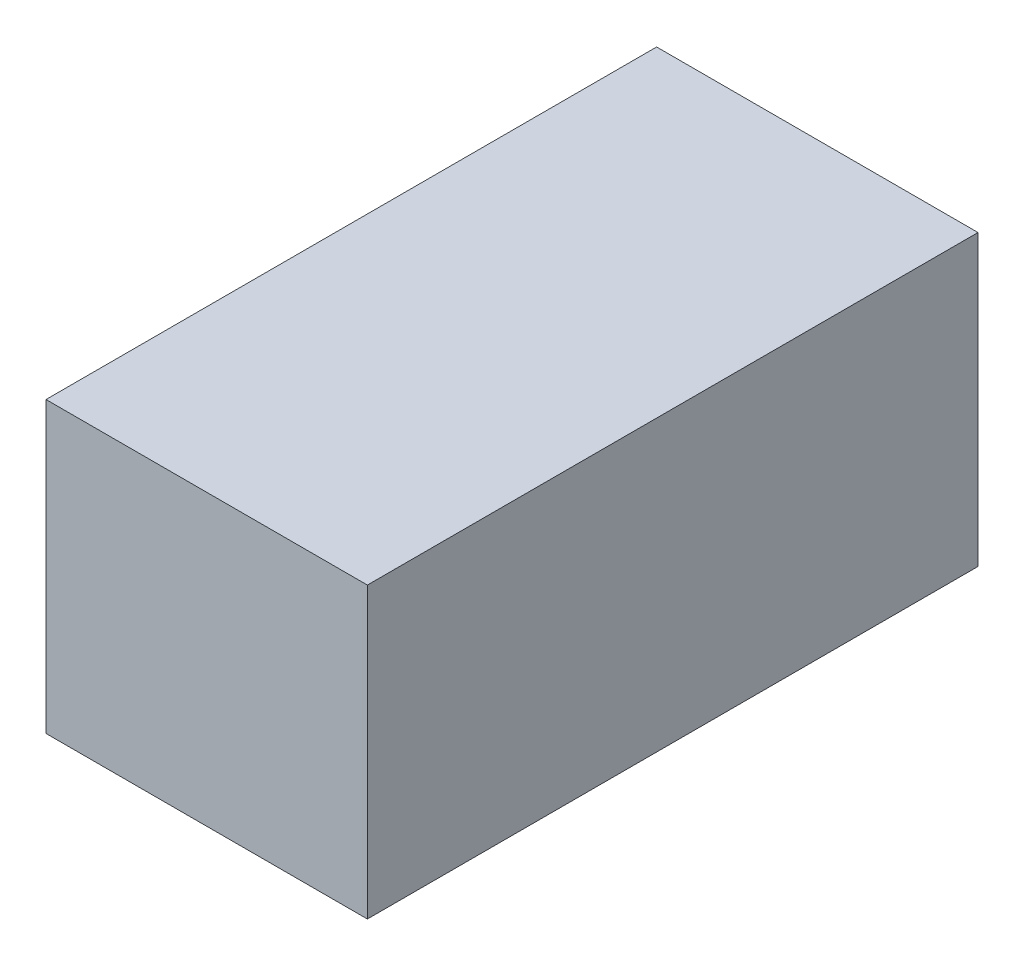
ISO-10303-21;
HEADER;
FILE_DESCRIPTION(('STEP AP214'),'2;1');
FILE_NAME('part.step','',(''),(''),'','','');
FILE_SCHEMA(('AUTOMOTIVE_DESIGN { 1 0 10303 214 1 1 1 1 }'));
ENDSEC;
DATA;
#1=APPLICATION_CONTEXT('core data for automotive mechanical design processes');
#2=APPLICATION_PROTOCOL_DEFINITION('international standard','automotive_design',2000,#1);
#3=PRODUCT_CONTEXT('',#1,'mechanical');
#4=PRODUCT('Part','Part','',(#3));
#5=PRODUCT_RELATED_PRODUCT_CATEGORY('part','',(#4));
#6=PRODUCT_DEFINITION_FORMATION('','',#4);
#7=PRODUCT_DEFINITION_CONTEXT('part definition',#1,'design');
#8=PRODUCT_DEFINITION('design','',#6,#7);
#9=PRODUCT_DEFINITION_SHAPE('','',#8);
#10=(LENGTH_UNIT() NAMED_UNIT(*) SI_UNIT(.MILLI.,.METRE.));
#11=(NAMED_UNIT(*) PLANE_ANGLE_UNIT() SI_UNIT($,.RADIAN.));
#12=(NAMED_UNIT(*) SI_UNIT($,.STERADIAN.) SOLID_ANGLE_UNIT());
#13=UNCERTAINTY_MEASURE_WITH_UNIT(LENGTH_MEASURE(1.E-05),#10,'distance_accuracy_value','');
#14=(GEOMETRIC_REPRESENTATION_CONTEXT(3) GLOBAL_UNCERTAINTY_ASSIGNED_CONTEXT((#13)) GLOBAL_UNIT_ASSIGNED_CONTEXT((#10,
#11,#12)) REPRESENTATION_CONTEXT('',''));
#15=CARTESIAN_POINT('',(0.,0.,0.));
#16=DIRECTION('',(0.,0.,1.));
#17=DIRECTION('',(1.,0.,0.));
#18=AXIS2_PLACEMENT_3D('',#15,#16,#17);
#19=CARTESIAN_POINT('',(25.,45.,47.5));
#20=DIRECTION('',(-1.,0.,0.));
#21=DIRECTION('',(0.,0.,1.));
#22=AXIS2_PLACEMENT_3D('',#19,#20,#21);
#23=PLANE('',#22);
#24=DIRECTION('',(0.,0.,-1.));
#25=VECTOR('',#24,1.);
#26=CARTESIAN_POINT('',(25.,0.,47.5));
#27=LINE('',#26,#25);
#28=CARTESIAN_POINT('',(25.,0.,47.5));
#29=VERTEX_POINT('',#28);
#30=CARTESIAN_POINT('',(25.,0.,-47.5));
#31=VERTEX_POINT('',#30);
#32=EDGE_CURVE('E100',#29,#31,#27,.T.);
#33=ORIENTED_EDGE('',*,*,#32,.T.);
#34=DIRECTION('',(0.,-1.,0.));
#35=VECTOR('',#34,1.);
#36=CARTESIAN_POINT('',(25.,45.,-47.5));
#37=LINE('',#36,#35);
#38=CARTESIAN_POINT('',(25.,45.,-47.5));
#39=VERTEX_POINT('',#38);
#40=EDGE_CURVE('E11',#39,#31,#37,.T.);
#41=ORIENTED_EDGE('',*,*,#40,.F.);
#42=DIRECTION('',(0.,0.,-1.));
#43=VECTOR('',#42,1.);
#44=CARTESIAN_POINT('',(25.,45.,47.5));
#45=LINE('',#44,#43);
#46=CARTESIAN_POINT('',(25.,45.,47.5));
#47=VERTEX_POINT('',#46);
#48=EDGE_CURVE('E88',#47,#39,#45,.T.);
#49=ORIENTED_EDGE('',*,*,#48,.F.);
#50=DIRECTION('',(0.,-1.,0.));
#51=VECTOR('',#50,1.);
#52=CARTESIAN_POINT('',(25.,45.,47.5));
#53=LINE('',#52,#51);
#54=EDGE_CURVE('E96',#47,#29,#53,.T.);
#55=ORIENTED_EDGE('',*,*,#54,.T.);
#56=EDGE_LOOP('',(#33,#41,#49,#55));
#57=FACE_BOUND('',#56,.T.);
#58=ADVANCED_FACE('F37',(#57),#23,.F.);
#59=CARTESIAN_POINT('',(-25.,45.,-47.5));
#60=DIRECTION('',(0.,0.,1.));
#61=DIRECTION('',(1.,0.,0.));
#62=AXIS2_PLACEMENT_3D('',#59,#60,#61);
#63=PLANE('',#62);
#64=CARTESIAN_POINT('',(0.,22.5,-47.5));
#65=DIRECTION('',(0.,0.,-1.));
#66=DIRECTION('',(-1.,0.,0.));
#67=AXIS2_PLACEMENT_3D('',#64,#65,#66);
#68=CIRCLE('',#67,20.);
#69=CARTESIAN_POINT('',(-20.,22.5,-47.5));
#70=VERTEX_POINT('',#69);
#71=EDGE_CURVE('E114',#70,#70,#68,.T.);
#72=ORIENTED_EDGE('',*,*,#71,.F.);
#73=EDGE_LOOP('',(#72));
#74=FACE_BOUND('',#73,.T.);
#75=DIRECTION('',(-1.,0.,0.));
#76=VECTOR('',#75,1.);
#77=CARTESIAN_POINT('',(-25.,0.,-47.5));
#78=LINE('',#77,#76);
#79=CARTESIAN_POINT('',(-25.,0.,-47.5));
#80=VERTEX_POINT('',#79);
#81=EDGE_CURVE('E92',#31,#80,#78,.T.);
#82=ORIENTED_EDGE('',*,*,#81,.T.);
#83=DIRECTION('',(0.,-1.,0.));
#84=VECTOR('',#83,1.);
#85=CARTESIAN_POINT('',(-25.,45.,-47.5));
#86=LINE('',#85,#84);
#87=CARTESIAN_POINT('',(-25.,45.,-47.5));
#88=VERTEX_POINT('',#87);
#89=EDGE_CURVE('E45',#88,#80,#86,.T.);
#90=ORIENTED_EDGE('',*,*,#89,.F.);
#91=DIRECTION('',(-1.,0.,0.));
#92=VECTOR('',#91,1.);
#93=CARTESIAN_POINT('',(-25.,45.,-47.5));
#94=LINE('',#93,#92);
#95=EDGE_CURVE('E83',#39,#88,#94,.T.);
#96=ORIENTED_EDGE('',*,*,#95,.F.);
#97=ORIENTED_EDGE('',*,*,#40,.T.);
#98=EDGE_LOOP('',(#82,#90,#96,#97));
#99=FACE_BOUND('',#98,.T.);
#100=ADVANCED_FACE('F91',(#74,#99),#63,.F.);
#101=CARTESIAN_POINT('',(-25.,45.,47.5));
#102=DIRECTION('',(1.,0.,0.));
#103=DIRECTION('',(0.,0.,-1.));
#104=AXIS2_PLACEMENT_3D('',#101,#102,#103);
#105=PLANE('',#104);
#106=DIRECTION('',(0.,0.,1.));
#107=VECTOR('',#106,1.);
#108=CARTESIAN_POINT('',(-25.,0.,47.5));
#109=LINE('',#108,#107);
#110=CARTESIAN_POINT('',(-25.,0.,47.5));
#111=VERTEX_POINT('',#110);
#112=EDGE_CURVE('E70',#80,#111,#109,.T.);
#113=ORIENTED_EDGE('',*,*,#112,.T.);
#114=DIRECTION('',(0.,-1.,0.));
#115=VECTOR('',#114,1.);
#116=CARTESIAN_POINT('',(-25.,45.,47.5));
#117=LINE('',#116,#115);
#118=CARTESIAN_POINT('',(-25.,45.,47.5));
#119=VERTEX_POINT('',#118);
#120=EDGE_CURVE('E93',#119,#111,#117,.T.);
#121=ORIENTED_EDGE('',*,*,#120,.F.);
#122=DIRECTION('',(0.,0.,1.));
#123=VECTOR('',#122,1.);
#124=CARTESIAN_POINT('',(-25.,45.,47.5));
#125=LINE('',#124,#123);
#126=EDGE_CURVE('E86',#88,#119,#125,.T.);
#127=ORIENTED_EDGE('',*,*,#126,.F.);
#128=ORIENTED_EDGE('',*,*,#89,.T.);
#129=EDGE_LOOP('',(#113,#121,#127,#128));
#130=FACE_BOUND('',#129,.T.);
#131=ADVANCED_FACE('F94',(#130),#105,.F.);
#132=CARTESIAN_POINT('',(-25.,45.,47.5));
#133=DIRECTION('',(0.,0.,-1.));
#134=DIRECTION('',(-1.,0.,0.));
#135=AXIS2_PLACEMENT_3D('',#132,#133,#134);
#136=PLANE('',#135);
#137=DIRECTION('',(1.,0.,0.));
#138=VECTOR('',#137,1.);
#139=CARTESIAN_POINT('',(-25.,0.,47.5));
#140=LINE('',#139,#138);
#141=EDGE_CURVE('E76',#111,#29,#140,.T.);
#142=ORIENTED_EDGE('',*,*,#141,.T.);
#143=ORIENTED_EDGE('',*,*,#54,.F.);
#144=DIRECTION('',(1.,0.,0.));
#145=VECTOR('',#144,1.);
#146=CARTESIAN_POINT('',(-25.,45.,47.5));
#147=LINE('',#146,#145);
#148=EDGE_CURVE('E53',#119,#47,#147,.T.);
#149=ORIENTED_EDGE('',*,*,#148,.F.);
#150=ORIENTED_EDGE('',*,*,#120,.T.);
#151=EDGE_LOOP('',(#142,#143,#149,#150));
#152=FACE_BOUND('',#151,.T.);
#153=ADVANCED_FACE('F108',(#152),#136,.F.);
#154=CARTESIAN_POINT('',(0.,45.,0.));
#155=DIRECTION('',(0.,-1.,0.));
#156=DIRECTION('',(0.,0.,-1.));
#157=AXIS2_PLACEMENT_3D('',#154,#155,#156);
#158=PLANE('',#157);
#159=ORIENTED_EDGE('',*,*,#48,.T.);
#160=ORIENTED_EDGE('',*,*,#95,.T.);
#161=ORIENTED_EDGE('',*,*,#126,.T.);
#162=ORIENTED_EDGE('',*,*,#148,.T.);
#163=EDGE_LOOP('',(#159,#160,#161,#162));
#164=FACE_BOUND('',#163,.T.);
#165=ADVANCED_FACE('F84',(#164),#158,.F.);
#166=CARTESIAN_POINT('',(0.,0.,0.));
#167=DIRECTION('',(0.,-1.,0.));
#168=DIRECTION('',(0.,0.,-1.));
#169=AXIS2_PLACEMENT_3D('',#166,#167,#168);
#170=PLANE('',#169);
#171=ORIENTED_EDGE('',*,*,#32,.F.);
#172=ORIENTED_EDGE('',*,*,#141,.F.);
#173=ORIENTED_EDGE('',*,*,#112,.F.);
#174=ORIENTED_EDGE('',*,*,#81,.F.);
#175=EDGE_LOOP('',(#171,#172,#173,#174));
#176=FACE_BOUND('',#175,.T.);
#177=ADVANCED_FACE('F111',(#176),#170,.T.);
#178=CARTESIAN_POINT('',(0.,22.5,-42.5));
#179=DIRECTION('',(0.,0.,-1.));
#180=DIRECTION('',(-1.,0.,0.));
#181=AXIS2_PLACEMENT_3D('',#178,#179,#180);
#182=CYLINDRICAL_SURFACE('',#181,20.);
#183=CARTESIAN_POINT('',(0.,22.5,-42.5));
#184=DIRECTION('',(0.,0.,-1.));
#185=DIRECTION('',(-1.,0.,0.));
#186=AXIS2_PLACEMENT_3D('',#183,#184,#185);
#187=CIRCLE('',#186,20.);
#188=CARTESIAN_POINT('',(-20.,22.5,-42.5));
#189=VERTEX_POINT('',#188);
#190=EDGE_CURVE('E103',#189,#189,#187,.T.);
#191=ORIENTED_EDGE('',*,*,#190,.F.);
#192=EDGE_LOOP('',(#191));
#193=FACE_BOUND('',#192,.T.);
#194=ORIENTED_EDGE('',*,*,#71,.T.);
#195=EDGE_LOOP('',(#194));
#196=FACE_BOUND('',#195,.T.);
#197=ADVANCED_FACE('F122',(#193,#196),#182,.F.);
#198=CARTESIAN_POINT('',(0.,22.5,-42.5));
#199=DIRECTION('',(0.,0.,-1.));
#200=DIRECTION('',(-1.,0.,0.));
#201=AXIS2_PLACEMENT_3D('',#198,#199,#200);
#202=PLANE('',#201);
#203=ORIENTED_EDGE('',*,*,#190,.T.);
#204=EDGE_LOOP('',(#203));
#205=FACE_BOUND('',#204,.T.);
#206=ADVANCED_FACE('F120',(#205),#202,.T.);
#207=CLOSED_SHELL('',(#58,#100,#131,#153,#165,#177,#197,#206));
#208=MANIFOLD_SOLID_BREP('B2',#207);
#209=ADVANCED_BREP_SHAPE_REPRESENTATION('',(#18,#208),#14);
#210=SHAPE_DEFINITION_REPRESENTATION(#9,#209);
ENDSEC;
END-ISO-10303-21;
